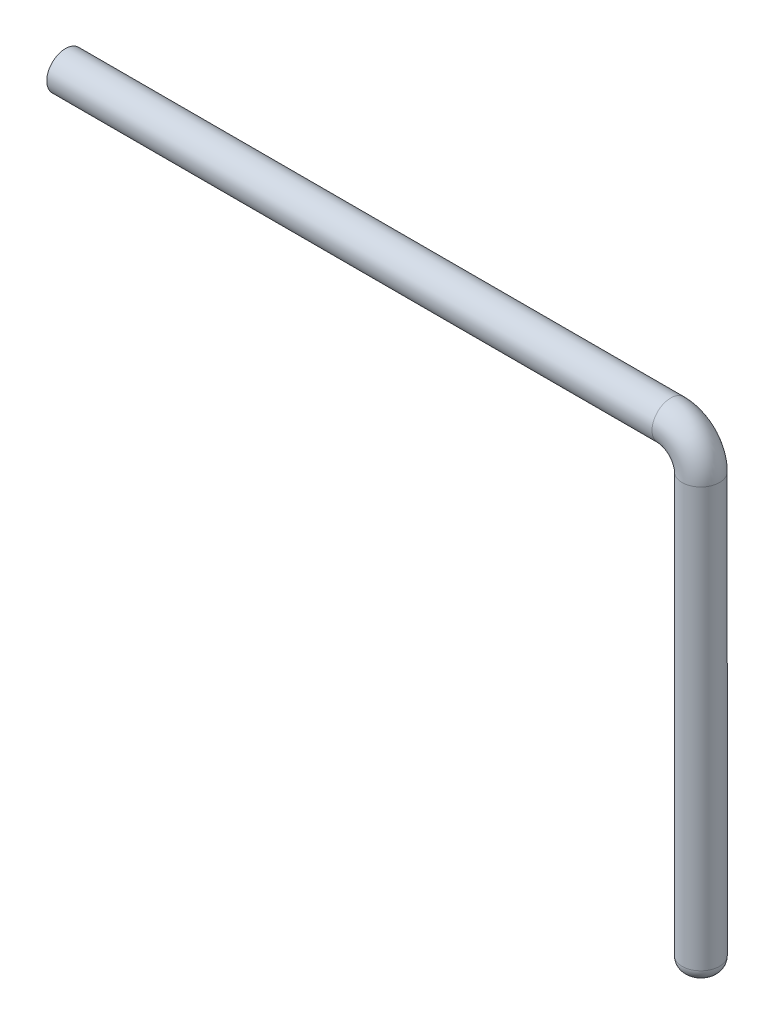
ISO-10303-21;
HEADER;
FILE_DESCRIPTION(('STEP AP214'),'2;1');
FILE_NAME('part.step','',(''),(''),'','','');
FILE_SCHEMA(('AUTOMOTIVE_DESIGN { 1 0 10303 214 1 1 1 1 }'));
ENDSEC;
DATA;
#1=APPLICATION_CONTEXT('core data for automotive mechanical design processes');
#2=APPLICATION_PROTOCOL_DEFINITION('international standard','automotive_design',2000,#1);
#3=PRODUCT_CONTEXT('',#1,'mechanical');
#4=PRODUCT('Part','Part','',(#3));
#5=PRODUCT_RELATED_PRODUCT_CATEGORY('part','',(#4));
#6=PRODUCT_DEFINITION_FORMATION('','',#4);
#7=PRODUCT_DEFINITION_CONTEXT('part definition',#1,'design');
#8=PRODUCT_DEFINITION('design','',#6,#7);
#9=PRODUCT_DEFINITION_SHAPE('','',#8);
#10=(LENGTH_UNIT() NAMED_UNIT(*) SI_UNIT(.MILLI.,.METRE.));
#11=(NAMED_UNIT(*) PLANE_ANGLE_UNIT() SI_UNIT($,.RADIAN.));
#12=(NAMED_UNIT(*) SI_UNIT($,.STERADIAN.) SOLID_ANGLE_UNIT());
#13=UNCERTAINTY_MEASURE_WITH_UNIT(LENGTH_MEASURE(1.E-05),#10,'distance_accuracy_value','');
#14=(GEOMETRIC_REPRESENTATION_CONTEXT(3) GLOBAL_UNCERTAINTY_ASSIGNED_CONTEXT((#13)) GLOBAL_UNIT_ASSIGNED_CONTEXT((#10,
#11,#12)) REPRESENTATION_CONTEXT('',''));
#15=CARTESIAN_POINT('',(0.,0.,0.));
#16=DIRECTION('',(0.,0.,1.));
#17=DIRECTION('',(1.,0.,0.));
#18=AXIS2_PLACEMENT_3D('',#15,#16,#17);
#19=CARTESIAN_POINT('',(17.0784775463847,29.8628299920876,0.));
#20=DIRECTION('',(-1.,0.,0.));
#21=DIRECTION('',(0.,0.,1.));
#22=AXIS2_PLACEMENT_3D('',#19,#20,#21);
#23=PLANE('',#22);
#24=CARTESIAN_POINT('',(17.0784775463847,29.8628299920876,0.));
#25=DIRECTION('',(-1.,0.,0.));
#26=DIRECTION('',(0.,0.,1.));
#27=AXIS2_PLACEMENT_3D('',#24,#25,#26);
#28=CIRCLE('',#27,0.310000000000001);
#29=CARTESIAN_POINT('',(17.0784775463847,29.8628299920876,0.310000000000001));
#30=VERTEX_POINT('',#29);
#31=EDGE_CURVE('E67',#30,#30,#28,.T.);
#32=ORIENTED_EDGE('',*,*,#31,.T.);
#33=EDGE_LOOP('',(#32));
#34=FACE_BOUND('',#33,.T.);
#35=ADVANCED_FACE('F47',(#34),#23,.T.);
#36=CARTESIAN_POINT('',(27.6184775463847,22.2128299920876,0.));
#37=DIRECTION('',(0.,1.,0.));
#38=DIRECTION('',(0.,0.,1.));
#39=AXIS2_PLACEMENT_3D('',#36,#37,#38);
#40=PLANE('',#39);
#41=CARTESIAN_POINT('',(27.6184775463847,22.2128299920876,0.));
#42=DIRECTION('',(0.,1.,0.));
#43=DIRECTION('',(0.,0.,1.));
#44=AXIS2_PLACEMENT_3D('',#41,#42,#43);
#45=CIRCLE('',#44,0.110000000000001);
#46=CARTESIAN_POINT('',(27.6184775463847,22.2128299920876,0.110000000000001));
#47=VERTEX_POINT('',#46);
#48=EDGE_CURVE('E11',#47,#47,#45,.F.);
#49=ORIENTED_EDGE('',*,*,#48,.T.);
#50=EDGE_LOOP('',(#49));
#51=FACE_BOUND('',#50,.T.);
#52=ADVANCED_FACE('F75',(#51),#40,.F.);
#53=CARTESIAN_POINT('',(17.0784775463847,29.8628299920876,0.));
#54=DIRECTION('',(1.,0.,0.));
#55=DIRECTION('',(0.,0.,-1.));
#56=AXIS2_PLACEMENT_3D('',#53,#54,#55);
#57=CYLINDRICAL_SURFACE('',#56,0.310000000000001);
#58=CARTESIAN_POINT('',(27.1184775463847,29.8628299920876,0.));
#59=DIRECTION('',(-1.,0.,0.));
#60=DIRECTION('',(0.,0.,1.));
#61=AXIS2_PLACEMENT_3D('',#58,#59,#60);
#62=CIRCLE('',#61,0.310000000000001);
#63=CARTESIAN_POINT('',(27.1184775463847,30.1728299920876,0.));
#64=VERTEX_POINT('',#63);
#65=EDGE_CURVE('E62',#64,#64,#62,.T.);
#66=ORIENTED_EDGE('',*,*,#65,.T.);
#67=EDGE_LOOP('',(#66));
#68=FACE_BOUND('',#67,.T.);
#69=ORIENTED_EDGE('',*,*,#31,.F.);
#70=EDGE_LOOP('',(#69));
#71=FACE_BOUND('',#70,.T.);
#72=ADVANCED_FACE('F72',(#68,#71),#57,.T.);
#73=CARTESIAN_POINT('',(27.1184775463847,29.3628299920876,0.));
#74=DIRECTION('',(0.,0.,-1.));
#75=DIRECTION('',(-1.,0.,0.));
#76=AXIS2_PLACEMENT_3D('',#73,#74,#75);
#77=TOROIDAL_SURFACE('',#76,0.5,0.310000000000001);
#78=CARTESIAN_POINT('',(27.6184775463846,29.3628299920878,0.));
#79=DIRECTION('',(0.,1.,0.));
#80=DIRECTION('',(0.,0.,1.));
#81=AXIS2_PLACEMENT_3D('',#78,#79,#80);
#82=CIRCLE('',#81,0.310000000000001);
#83=CARTESIAN_POINT('',(27.9284775463847,29.3628299920879,0.));
#84=VERTEX_POINT('',#83);
#85=EDGE_CURVE('E58',#84,#84,#82,.T.);
#86=CARTESIAN_POINT('',(27.1184775463847,29.3628299920876,0.));
#87=DIRECTION('',(0.,0.,-1.));
#88=DIRECTION('',(-1.,0.,0.));
#89=AXIS2_PLACEMENT_3D('',#86,#87,#88);
#90=CIRCLE('',#89,0.810000000000002);
#91=EDGE_CURVE('',#64,#84,#90,.T.);
#92=ORIENTED_EDGE('',*,*,#65,.F.);
#93=ORIENTED_EDGE('',*,*,#85,.T.);
#94=ORIENTED_EDGE('',*,*,#91,.T.);
#95=ORIENTED_EDGE('',*,*,#91,.F.);
#96=EDGE_LOOP('',(#92,#94,#93,#95));
#97=FACE_BOUND('',#96,.T.);
#98=ADVANCED_FACE('F74',(#97),#77,.T.);
#99=CARTESIAN_POINT('',(27.6184775463847,29.3628299920876,0.));
#100=DIRECTION('',(0.,-1.,0.));
#101=DIRECTION('',(0.,0.,-1.));
#102=AXIS2_PLACEMENT_3D('',#99,#100,#101);
#103=CYLINDRICAL_SURFACE('',#102,0.310000000000001);
#104=CARTESIAN_POINT('',(27.6184775463847,22.4128299920876,0.));
#105=DIRECTION('',(0.,1.,0.));
#106=DIRECTION('',(0.,0.,1.));
#107=AXIS2_PLACEMENT_3D('',#104,#105,#106);
#108=CIRCLE('',#107,0.310000000000001);
#109=CARTESIAN_POINT('',(27.6184775463847,22.4128299920876,0.310000000000001));
#110=VERTEX_POINT('',#109);
#111=EDGE_CURVE('E54',#110,#110,#108,.T.);
#112=ORIENTED_EDGE('',*,*,#111,.T.);
#113=EDGE_LOOP('',(#112));
#114=FACE_BOUND('',#113,.T.);
#115=ORIENTED_EDGE('',*,*,#85,.F.);
#116=EDGE_LOOP('',(#115));
#117=FACE_BOUND('',#116,.T.);
#118=ADVANCED_FACE('F82',(#114,#117),#103,.T.);
#119=CARTESIAN_POINT('',(27.6184775463847,22.4128299920876,0.));
#120=DIRECTION('',(0.,1.,0.));
#121=DIRECTION('',(0.,0.,1.));
#122=AXIS2_PLACEMENT_3D('',#119,#120,#121);
#123=DEGENERATE_TOROIDAL_SURFACE('',#122,0.110000000000001,0.2,.T.);
#124=ORIENTED_EDGE('',*,*,#48,.F.);
#125=EDGE_LOOP('',(#124));
#126=FACE_BOUND('',#125,.T.);
#127=ORIENTED_EDGE('',*,*,#111,.F.);
#128=EDGE_LOOP('',(#127));
#129=FACE_BOUND('',#128,.T.);
#130=ADVANCED_FACE('F49',(#126,#129),#123,.T.);
#131=CLOSED_SHELL('',(#35,#52,#72,#98,#118,#130));
#132=MANIFOLD_SOLID_BREP('B2',#131);
#133=ADVANCED_BREP_SHAPE_REPRESENTATION('',(#18,#132),#14);
#134=SHAPE_DEFINITION_REPRESENTATION(#9,#133);
ENDSEC;
END-ISO-10303-21;
